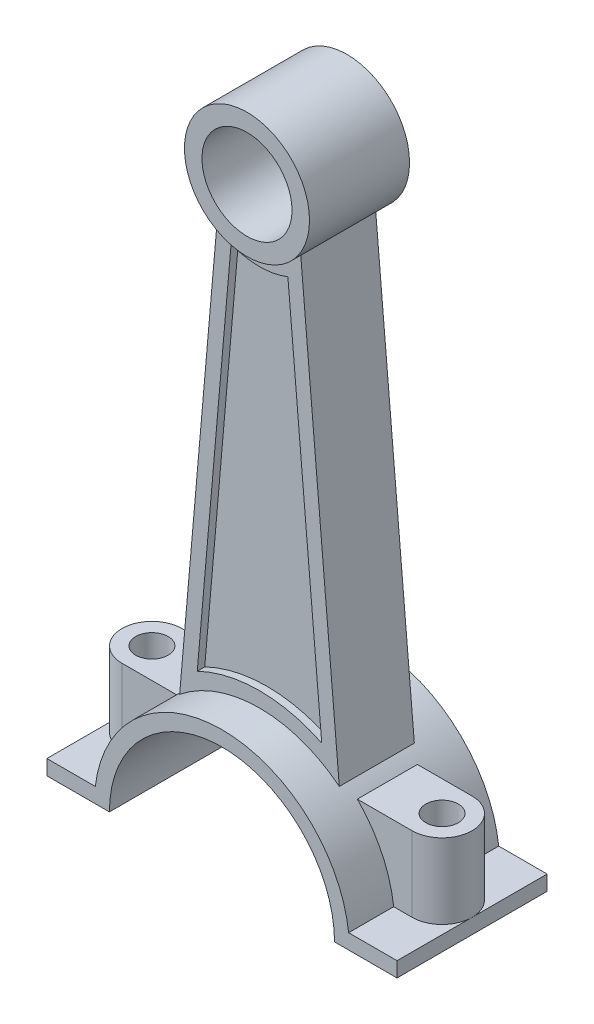
ISO-10303-21;
HEADER;
FILE_DESCRIPTION(('STEP AP214'),'2;1');
FILE_NAME('part.step','',(''),(''),'','','');
FILE_SCHEMA(('AUTOMOTIVE_DESIGN { 1 0 10303 214 1 1 1 1 }'));
ENDSEC;
DATA;
#1=APPLICATION_CONTEXT('core data for automotive mechanical design processes');
#2=APPLICATION_PROTOCOL_DEFINITION('international standard','automotive_design',2000,#1);
#3=PRODUCT_CONTEXT('',#1,'mechanical');
#4=PRODUCT('Part','Part','',(#3));
#5=PRODUCT_RELATED_PRODUCT_CATEGORY('part','',(#4));
#6=PRODUCT_DEFINITION_FORMATION('','',#4);
#7=PRODUCT_DEFINITION_CONTEXT('part definition',#1,'design');
#8=PRODUCT_DEFINITION('design','',#6,#7);
#9=PRODUCT_DEFINITION_SHAPE('','',#8);
#10=(LENGTH_UNIT() NAMED_UNIT(*) SI_UNIT(.MILLI.,.METRE.));
#11=(NAMED_UNIT(*) PLANE_ANGLE_UNIT() SI_UNIT($,.RADIAN.));
#12=(NAMED_UNIT(*) SI_UNIT($,.STERADIAN.) SOLID_ANGLE_UNIT());
#13=UNCERTAINTY_MEASURE_WITH_UNIT(LENGTH_MEASURE(1.E-05),#10,'distance_accuracy_value','');
#14=(GEOMETRIC_REPRESENTATION_CONTEXT(3) GLOBAL_UNCERTAINTY_ASSIGNED_CONTEXT((#13)) GLOBAL_UNIT_ASSIGNED_CONTEXT((#10,
#11,#12)) REPRESENTATION_CONTEXT('',''));
#15=CARTESIAN_POINT('',(0.,0.,0.));
#16=DIRECTION('',(0.,0.,1.));
#17=DIRECTION('',(1.,0.,0.));
#18=AXIS2_PLACEMENT_3D('',#15,#16,#17);
#19=CARTESIAN_POINT('',(35.,0.,15.));
#20=DIRECTION('',(-1.,0.,0.));
#21=DIRECTION('',(0.,0.,1.));
#22=AXIS2_PLACEMENT_3D('',#19,#20,#21);
#23=PLANE('',#22);
#24=DIRECTION('',(0.,0.,-1.));
#25=VECTOR('',#24,1.);
#26=CARTESIAN_POINT('',(35.,-114.4,15.));
#27=LINE('',#26,#25);
#28=CARTESIAN_POINT('',(35.,-114.4,0.));
#29=VERTEX_POINT('',#28);
#30=CARTESIAN_POINT('',(35.,-114.4,-15.));
#31=VERTEX_POINT('',#30);
#32=EDGE_CURVE('E469',#29,#31,#27,.T.);
#33=ORIENTED_EDGE('',*,*,#32,.F.);
#34=CARTESIAN_POINT('',(35.,-114.4,15.));
#35=VERTEX_POINT('',#34);
#36=EDGE_CURVE('E470',#35,#29,#27,.T.);
#37=ORIENTED_EDGE('',*,*,#36,.F.);
#38=DIRECTION('',(0.,1.,0.));
#39=VECTOR('',#38,1.);
#40=CARTESIAN_POINT('',(35.,0.,15.));
#41=LINE('',#40,#39);
#42=CARTESIAN_POINT('',(35.,-117.4,15.));
#43=VERTEX_POINT('',#42);
#44=EDGE_CURVE('E417',#43,#35,#41,.T.);
#45=ORIENTED_EDGE('',*,*,#44,.F.);
#46=DIRECTION('',(0.,0.,-1.));
#47=VECTOR('',#46,1.);
#48=CARTESIAN_POINT('',(35.,-117.4,15.));
#49=LINE('',#48,#47);
#50=CARTESIAN_POINT('',(35.,-117.4,-15.));
#51=VERTEX_POINT('',#50);
#52=EDGE_CURVE('E44',#43,#51,#49,.T.);
#53=ORIENTED_EDGE('',*,*,#52,.T.);
#54=DIRECTION('',(0.,1.,0.));
#55=VECTOR('',#54,1.);
#56=CARTESIAN_POINT('',(35.,0.,-15.));
#57=LINE('',#56,#55);
#58=EDGE_CURVE('E437',#51,#31,#57,.T.);
#59=ORIENTED_EDGE('',*,*,#58,.T.);
#60=EDGE_LOOP('',(#33,#37,#45,#53,#59));
#61=FACE_BOUND('',#60,.T.);
#62=ADVANCED_FACE('F36',(#61),#23,.F.);
#63=CARTESIAN_POINT('',(0.,-99.4,6.));
#64=DIRECTION('',(0.,1.,0.));
#65=DIRECTION('',(0.,0.,1.));
#66=AXIS2_PLACEMENT_3D('',#63,#64,#65);
#67=PLANE('',#66);
#68=CARTESIAN_POINT('',(-29.,-99.4,0.));
#69=DIRECTION('',(0.,1.,0.));
#70=DIRECTION('',(0.,0.,1.));
#71=AXIS2_PLACEMENT_3D('',#68,#69,#70);
#72=CIRCLE('',#71,3.25);
#73=CARTESIAN_POINT('',(-29.,-99.4,3.25));
#74=VERTEX_POINT('',#73);
#75=EDGE_CURVE('E299',#74,#74,#72,.T.);
#76=ORIENTED_EDGE('',*,*,#75,.F.);
#77=EDGE_LOOP('',(#76));
#78=FACE_BOUND('',#77,.T.);
#79=DIRECTION('',(1.,0.,0.));
#80=VECTOR('',#79,1.);
#81=CARTESIAN_POINT('',(0.,-99.4,-6.));
#82=LINE('',#81,#80);
#83=CARTESIAN_POINT('',(-29.,-99.4,-6.00000000000001));
#84=VERTEX_POINT('',#83);
#85=CARTESIAN_POINT('',(-18.0623918681884,-99.4,-6.));
#86=VERTEX_POINT('',#85);
#87=EDGE_CURVE('E405',#84,#86,#82,.T.);
#88=ORIENTED_EDGE('',*,*,#87,.F.);
#89=CARTESIAN_POINT('',(-29.,-99.4,0.));
#90=DIRECTION('',(0.,1.,0.));
#91=DIRECTION('',(0.,0.,1.));
#92=AXIS2_PLACEMENT_3D('',#89,#90,#91);
#93=CIRCLE('',#92,6.00000000000001);
#94=CARTESIAN_POINT('',(-29.,-99.4,6.00000000000001));
#95=VERTEX_POINT('',#94);
#96=EDGE_CURVE('E322',#95,#84,#93,.F.);
#97=ORIENTED_EDGE('',*,*,#96,.F.);
#98=DIRECTION('',(1.,0.,0.));
#99=VECTOR('',#98,1.);
#100=CARTESIAN_POINT('',(0.,-99.4,6.));
#101=LINE('',#100,#99);
#102=CARTESIAN_POINT('',(-18.0623918681884,-99.4,6.));
#103=VERTEX_POINT('',#102);
#104=EDGE_CURVE('E397',#95,#103,#101,.T.);
#105=ORIENTED_EDGE('',*,*,#104,.T.);
#106=DIRECTION('',(0.,0.,-1.));
#107=VECTOR('',#106,1.);
#108=CARTESIAN_POINT('',(-18.0623918681884,-99.4,6.));
#109=LINE('',#108,#107);
#110=EDGE_CURVE('E402',#103,#86,#109,.T.);
#111=ORIENTED_EDGE('',*,*,#110,.T.);
#112=EDGE_LOOP('',(#88,#97,#105,#111));
#113=FACE_BOUND('',#112,.T.);
#114=ADVANCED_FACE('F537',(#78,#113),#67,.T.);
#115=CARTESIAN_POINT('',(0.,-99.4,6.));
#116=DIRECTION('',(0.,-1.,0.));
#117=DIRECTION('',(0.,0.,-1.));
#118=AXIS2_PLACEMENT_3D('',#115,#116,#117);
#119=PLANE('',#118);
#120=CARTESIAN_POINT('',(29.,-99.4,0.));
#121=DIRECTION('',(0.,1.,0.));
#122=DIRECTION('',(0.,0.,1.));
#123=AXIS2_PLACEMENT_3D('',#120,#121,#122);
#124=CIRCLE('',#123,3.25);
#125=CARTESIAN_POINT('',(29.,-99.4,3.25));
#126=VERTEX_POINT('',#125);
#127=EDGE_CURVE('E289',#126,#126,#124,.T.);
#128=ORIENTED_EDGE('',*,*,#127,.F.);
#129=EDGE_LOOP('',(#128));
#130=FACE_BOUND('',#129,.T.);
#131=CARTESIAN_POINT('',(29.,-99.4,0.));
#132=DIRECTION('',(0.,1.,0.));
#133=DIRECTION('',(0.,0.,1.));
#134=AXIS2_PLACEMENT_3D('',#131,#132,#133);
#135=CIRCLE('',#134,6.00000000000001);
#136=CARTESIAN_POINT('',(29.,-99.4,6.));
#137=VERTEX_POINT('',#136);
#138=CARTESIAN_POINT('',(29.,-99.4,-6.));
#139=VERTEX_POINT('',#138);
#140=EDGE_CURVE('E314',#137,#139,#135,.T.);
#141=ORIENTED_EDGE('',*,*,#140,.T.);
#142=DIRECTION('',(-1.,0.,0.));
#143=VECTOR('',#142,1.);
#144=CARTESIAN_POINT('',(0.,-99.4,-6.));
#145=LINE('',#144,#143);
#146=CARTESIAN_POINT('',(18.0623918681885,-99.4,-6.));
#147=VERTEX_POINT('',#146);
#148=EDGE_CURVE('E381',#139,#147,#145,.T.);
#149=ORIENTED_EDGE('',*,*,#148,.T.);
#150=DIRECTION('',(0.,0.,-1.));
#151=VECTOR('',#150,1.);
#152=CARTESIAN_POINT('',(18.0623918681885,-99.4,6.));
#153=LINE('',#152,#151);
#154=CARTESIAN_POINT('',(18.0623918681885,-99.4,6.));
#155=VERTEX_POINT('',#154);
#156=EDGE_CURVE('E385',#155,#147,#153,.T.);
#157=ORIENTED_EDGE('',*,*,#156,.F.);
#158=DIRECTION('',(-1.,0.,0.));
#159=VECTOR('',#158,1.);
#160=CARTESIAN_POINT('',(0.,-99.4,6.));
#161=LINE('',#160,#159);
#162=EDGE_CURVE('E383',#137,#155,#161,.T.);
#163=ORIENTED_EDGE('',*,*,#162,.F.);
#164=EDGE_LOOP('',(#141,#149,#157,#163));
#165=FACE_BOUND('',#164,.T.);
#166=ADVANCED_FACE('F535',(#130,#165),#119,.F.);
#167=CARTESIAN_POINT('',(-35.,0.,15.));
#168=DIRECTION('',(-1.,0.,0.));
#169=DIRECTION('',(0.,0.,1.));
#170=AXIS2_PLACEMENT_3D('',#167,#168,#169);
#171=PLANE('',#170);
#172=DIRECTION('',(0.,0.,-1.));
#173=VECTOR('',#172,1.);
#174=CARTESIAN_POINT('',(-35.,-114.4,15.));
#175=LINE('',#174,#173);
#176=CARTESIAN_POINT('',(-35.,-114.4,15.));
#177=VERTEX_POINT('',#176);
#178=CARTESIAN_POINT('',(-35.,-114.4,0.));
#179=VERTEX_POINT('',#178);
#180=EDGE_CURVE('E458',#177,#179,#175,.T.);
#181=ORIENTED_EDGE('',*,*,#180,.T.);
#182=CARTESIAN_POINT('',(-35.,-114.4,-15.));
#183=VERTEX_POINT('',#182);
#184=EDGE_CURVE('E457',#179,#183,#175,.T.);
#185=ORIENTED_EDGE('',*,*,#184,.T.);
#186=DIRECTION('',(0.,1.,0.));
#187=VECTOR('',#186,1.);
#188=CARTESIAN_POINT('',(-35.,0.,-15.));
#189=LINE('',#188,#187);
#190=CARTESIAN_POINT('',(-35.,-117.4,-15.));
#191=VERTEX_POINT('',#190);
#192=EDGE_CURVE('E449',#191,#183,#189,.T.);
#193=ORIENTED_EDGE('',*,*,#192,.F.);
#194=DIRECTION('',(0.,0.,-1.));
#195=VECTOR('',#194,1.);
#196=CARTESIAN_POINT('',(-35.,-117.4,15.));
#197=LINE('',#196,#195);
#198=CARTESIAN_POINT('',(-35.,-117.4,15.));
#199=VERTEX_POINT('',#198);
#200=EDGE_CURVE('E455',#199,#191,#197,.T.);
#201=ORIENTED_EDGE('',*,*,#200,.F.);
#202=DIRECTION('',(0.,1.,0.));
#203=VECTOR('',#202,1.);
#204=CARTESIAN_POINT('',(-35.,0.,15.));
#205=LINE('',#204,#203);
#206=EDGE_CURVE('E426',#199,#177,#205,.T.);
#207=ORIENTED_EDGE('',*,*,#206,.T.);
#208=EDGE_LOOP('',(#181,#185,#193,#201,#207));
#209=FACE_BOUND('',#208,.T.);
#210=ADVANCED_FACE('F510',(#209),#171,.T.);
#211=CARTESIAN_POINT('',(0.,0.,-6.));
#212=DIRECTION('',(0.,0.,1.));
#213=DIRECTION('',(1.,0.,0.));
#214=AXIS2_PLACEMENT_3D('',#211,#212,#213);
#215=PLANE('',#214);
#216=DIRECTION('',(0.,1.,0.));
#217=VECTOR('',#216,1.);
#218=CARTESIAN_POINT('',(-29.,-114.4,-6.00000000000001));
#219=LINE('',#218,#217);
#220=CARTESIAN_POINT('',(-29.,-114.4,-6.00000000000001));
#221=VERTEX_POINT('',#220);
#222=EDGE_CURVE('E310',#221,#84,#219,.T.);
#223=ORIENTED_EDGE('',*,*,#222,.T.);
#224=ORIENTED_EDGE('',*,*,#87,.T.);
#225=CARTESIAN_POINT('',(0.,-117.4,-6.));
#226=DIRECTION('',(0.,0.,1.));
#227=DIRECTION('',(1.,0.,0.));
#228=AXIS2_PLACEMENT_3D('',#225,#226,#227);
#229=CIRCLE('',#228,25.5);
#230=CARTESIAN_POINT('',(-25.3229145242012,-114.4,-6.));
#231=VERTEX_POINT('',#230);
#232=EDGE_CURVE('E393',#86,#231,#229,.T.);
#233=ORIENTED_EDGE('',*,*,#232,.T.);
#234=DIRECTION('',(1.,0.,0.));
#235=VECTOR('',#234,1.);
#236=CARTESIAN_POINT('',(0.,-114.4,-6.));
#237=LINE('',#236,#235);
#238=EDGE_CURVE('E398',#221,#231,#237,.T.);
#239=ORIENTED_EDGE('',*,*,#238,.F.);
#240=EDGE_LOOP('',(#223,#224,#233,#239));
#241=FACE_BOUND('',#240,.T.);
#242=ADVANCED_FACE('F544',(#241),#215,.F.);
#243=CARTESIAN_POINT('',(0.,0.,-6.));
#244=DIRECTION('',(0.,0.,1.));
#245=DIRECTION('',(1.,0.,0.));
#246=AXIS2_PLACEMENT_3D('',#243,#244,#245);
#247=PLANE('',#246);
#248=DIRECTION('',(0.,1.,0.));
#249=VECTOR('',#248,1.);
#250=CARTESIAN_POINT('',(29.,-114.4,-6.));
#251=LINE('',#250,#249);
#252=CARTESIAN_POINT('',(29.,-114.4,-6.));
#253=VERTEX_POINT('',#252);
#254=EDGE_CURVE('E311',#253,#139,#251,.T.);
#255=ORIENTED_EDGE('',*,*,#254,.F.);
#256=DIRECTION('',(-1.,0.,0.));
#257=VECTOR('',#256,1.);
#258=CARTESIAN_POINT('',(0.,-114.4,-6.));
#259=LINE('',#258,#257);
#260=CARTESIAN_POINT('',(25.3229145242012,-114.4,-6.));
#261=VERTEX_POINT('',#260);
#262=EDGE_CURVE('E388',#253,#261,#259,.T.);
#263=ORIENTED_EDGE('',*,*,#262,.T.);
#264=CARTESIAN_POINT('',(0.,-117.4,-6.));
#265=DIRECTION('',(0.,0.,1.));
#266=DIRECTION('',(1.,0.,0.));
#267=AXIS2_PLACEMENT_3D('',#264,#265,#266);
#268=CIRCLE('',#267,25.5);
#269=EDGE_CURVE('E376',#261,#147,#268,.T.);
#270=ORIENTED_EDGE('',*,*,#269,.T.);
#271=ORIENTED_EDGE('',*,*,#148,.F.);
#272=EDGE_LOOP('',(#255,#263,#270,#271));
#273=FACE_BOUND('',#272,.T.);
#274=ADVANCED_FACE('F525',(#273),#247,.F.);
#275=CARTESIAN_POINT('',(0.,0.,6.));
#276=DIRECTION('',(0.,0.,1.));
#277=DIRECTION('',(1.,0.,0.));
#278=AXIS2_PLACEMENT_3D('',#275,#276,#277);
#279=PLANE('',#278);
#280=ORIENTED_EDGE('',*,*,#104,.F.);
#281=DIRECTION('',(0.,1.,0.));
#282=VECTOR('',#281,1.);
#283=CARTESIAN_POINT('',(-29.,-114.4,6.00000000000001));
#284=LINE('',#283,#282);
#285=CARTESIAN_POINT('',(-29.,-114.4,6.00000000000001));
#286=VERTEX_POINT('',#285);
#287=EDGE_CURVE('E321',#286,#95,#284,.T.);
#288=ORIENTED_EDGE('',*,*,#287,.F.);
#289=DIRECTION('',(1.,0.,0.));
#290=VECTOR('',#289,1.);
#291=CARTESIAN_POINT('',(0.,-114.4,6.));
#292=LINE('',#291,#290);
#293=CARTESIAN_POINT('',(-25.3229145242012,-114.4,6.));
#294=VERTEX_POINT('',#293);
#295=EDGE_CURVE('E400',#286,#294,#292,.T.);
#296=ORIENTED_EDGE('',*,*,#295,.T.);
#297=CARTESIAN_POINT('',(0.,-117.4,6.));
#298=DIRECTION('',(0.,0.,1.));
#299=DIRECTION('',(1.,0.,0.));
#300=AXIS2_PLACEMENT_3D('',#297,#298,#299);
#301=CIRCLE('',#300,25.5);
#302=EDGE_CURVE('E394',#103,#294,#301,.T.);
#303=ORIENTED_EDGE('',*,*,#302,.F.);
#304=EDGE_LOOP('',(#280,#288,#296,#303));
#305=FACE_BOUND('',#304,.T.);
#306=ADVANCED_FACE('F619',(#305),#279,.T.);
#307=CARTESIAN_POINT('',(0.,0.,6.));
#308=DIRECTION('',(0.,0.,1.));
#309=DIRECTION('',(1.,0.,0.));
#310=AXIS2_PLACEMENT_3D('',#307,#308,#309);
#311=PLANE('',#310);
#312=DIRECTION('',(-1.,0.,0.));
#313=VECTOR('',#312,1.);
#314=CARTESIAN_POINT('',(0.,-114.4,6.));
#315=LINE('',#314,#313);
#316=CARTESIAN_POINT('',(29.,-114.4,6.));
#317=VERTEX_POINT('',#316);
#318=CARTESIAN_POINT('',(25.3229145242012,-114.4,6.));
#319=VERTEX_POINT('',#318);
#320=EDGE_CURVE('E380',#317,#319,#315,.T.);
#321=ORIENTED_EDGE('',*,*,#320,.F.);
#322=DIRECTION('',(0.,1.,0.));
#323=VECTOR('',#322,1.);
#324=CARTESIAN_POINT('',(29.,-114.4,6.));
#325=LINE('',#324,#323);
#326=EDGE_CURVE('E324',#317,#137,#325,.T.);
#327=ORIENTED_EDGE('',*,*,#326,.T.);
#328=ORIENTED_EDGE('',*,*,#162,.T.);
#329=CARTESIAN_POINT('',(0.,-117.4,6.));
#330=DIRECTION('',(0.,0.,1.));
#331=DIRECTION('',(1.,0.,0.));
#332=AXIS2_PLACEMENT_3D('',#329,#330,#331);
#333=CIRCLE('',#332,25.5);
#334=EDGE_CURVE('E377',#319,#155,#333,.T.);
#335=ORIENTED_EDGE('',*,*,#334,.F.);
#336=EDGE_LOOP('',(#321,#327,#328,#335));
#337=FACE_BOUND('',#336,.T.);
#338=ADVANCED_FACE('F532',(#337),#311,.T.);
#339=CARTESIAN_POINT('',(0.,-114.4,15.));
#340=DIRECTION('',(0.,-1.,0.));
#341=DIRECTION('',(0.,0.,-1.));
#342=AXIS2_PLACEMENT_3D('',#339,#340,#341);
#343=PLANE('',#342);
#344=ORIENTED_EDGE('',*,*,#262,.F.);
#345=CARTESIAN_POINT('',(29.,-114.4,0.));
#346=DIRECTION('',(0.,1.,0.));
#347=DIRECTION('',(0.,0.,1.));
#348=AXIS2_PLACEMENT_3D('',#345,#346,#347);
#349=CIRCLE('',#348,6.00000000000001);
#350=EDGE_CURVE('E298',#29,#253,#349,.T.);
#351=ORIENTED_EDGE('',*,*,#350,.F.);
#352=ORIENTED_EDGE('',*,*,#32,.T.);
#353=DIRECTION('',(-1.,0.,0.));
#354=VECTOR('',#353,1.);
#355=CARTESIAN_POINT('',(0.,-114.4,-15.));
#356=LINE('',#355,#354);
#357=CARTESIAN_POINT('',(25.3229145242012,-114.4,-15.));
#358=VERTEX_POINT('',#357);
#359=EDGE_CURVE('E440',#31,#358,#356,.T.);
#360=ORIENTED_EDGE('',*,*,#359,.T.);
#361=DIRECTION('',(0.,0.,-1.));
#362=VECTOR('',#361,1.);
#363=CARTESIAN_POINT('',(25.3229145242012,-114.4,15.));
#364=LINE('',#363,#362);
#365=EDGE_CURVE('E465',#261,#358,#364,.T.);
#366=ORIENTED_EDGE('',*,*,#365,.F.);
#367=EDGE_LOOP('',(#344,#351,#352,#360,#366));
#368=FACE_BOUND('',#367,.T.);
#369=ADVANCED_FACE('F489',(#368),#343,.F.);
#370=CARTESIAN_POINT('',(0.,-114.4,15.));
#371=DIRECTION('',(0.,1.,0.));
#372=DIRECTION('',(0.,0.,1.));
#373=AXIS2_PLACEMENT_3D('',#370,#371,#372);
#374=PLANE('',#373);
#375=ORIENTED_EDGE('',*,*,#184,.F.);
#376=CARTESIAN_POINT('',(-29.,-114.4,0.));
#377=DIRECTION('',(0.,1.,0.));
#378=DIRECTION('',(0.,0.,1.));
#379=AXIS2_PLACEMENT_3D('',#376,#377,#378);
#380=CIRCLE('',#379,6.00000000000001);
#381=EDGE_CURVE('E307',#179,#221,#380,.F.);
#382=ORIENTED_EDGE('',*,*,#381,.T.);
#383=ORIENTED_EDGE('',*,*,#238,.T.);
#384=DIRECTION('',(0.,0.,-1.));
#385=VECTOR('',#384,1.);
#386=CARTESIAN_POINT('',(-25.3229145242012,-114.4,15.));
#387=LINE('',#386,#385);
#388=CARTESIAN_POINT('',(-25.3229145242012,-114.4,-15.));
#389=VERTEX_POINT('',#388);
#390=EDGE_CURVE('E461',#231,#389,#387,.T.);
#391=ORIENTED_EDGE('',*,*,#390,.T.);
#392=DIRECTION('',(1.,0.,0.));
#393=VECTOR('',#392,1.);
#394=CARTESIAN_POINT('',(0.,-114.4,-15.));
#395=LINE('',#394,#393);
#396=EDGE_CURVE('E446',#183,#389,#395,.T.);
#397=ORIENTED_EDGE('',*,*,#396,.F.);
#398=EDGE_LOOP('',(#375,#382,#383,#391,#397));
#399=FACE_BOUND('',#398,.T.);
#400=ADVANCED_FACE('F513',(#399),#374,.T.);
#401=CARTESIAN_POINT('',(0.,-117.4,15.));
#402=DIRECTION('',(0.,0.,-1.));
#403=DIRECTION('',(-1.,0.,0.));
#404=AXIS2_PLACEMENT_3D('',#401,#402,#403);
#405=CYLINDRICAL_SURFACE('',#404,22.5);
#406=CARTESIAN_POINT('',(0.,-117.4,-15.));
#407=DIRECTION('',(0.,0.,1.));
#408=DIRECTION('',(1.,0.,0.));
#409=AXIS2_PLACEMENT_3D('',#406,#407,#408);
#410=CIRCLE('',#409,22.5);
#411=CARTESIAN_POINT('',(22.5,-117.4,-15.));
#412=VERTEX_POINT('',#411);
#413=CARTESIAN_POINT('',(-22.5,-117.4,-15.));
#414=VERTEX_POINT('',#413);
#415=EDGE_CURVE('E410',#412,#414,#410,.T.);
#416=ORIENTED_EDGE('',*,*,#415,.F.);
#417=DIRECTION('',(0.,0.,-1.));
#418=VECTOR('',#417,1.);
#419=CARTESIAN_POINT('',(22.5,-117.4,15.));
#420=LINE('',#419,#418);
#421=CARTESIAN_POINT('',(22.5,-117.4,15.));
#422=VERTEX_POINT('',#421);
#423=EDGE_CURVE('E11',#422,#412,#420,.T.);
#424=ORIENTED_EDGE('',*,*,#423,.F.);
#425=CARTESIAN_POINT('',(0.,-117.4,15.));
#426=DIRECTION('',(0.,0.,1.));
#427=DIRECTION('',(1.,0.,0.));
#428=AXIS2_PLACEMENT_3D('',#425,#426,#427);
#429=CIRCLE('',#428,22.5);
#430=CARTESIAN_POINT('',(-22.5,-117.4,15.));
#431=VERTEX_POINT('',#430);
#432=EDGE_CURVE('E411',#422,#431,#429,.T.);
#433=ORIENTED_EDGE('',*,*,#432,.T.);
#434=DIRECTION('',(0.,0.,-1.));
#435=VECTOR('',#434,1.);
#436=CARTESIAN_POINT('',(-22.5,-117.4,15.));
#437=LINE('',#436,#435);
#438=EDGE_CURVE('E432',#431,#414,#437,.T.);
#439=ORIENTED_EDGE('',*,*,#438,.T.);
#440=EDGE_LOOP('',(#416,#424,#433,#439));
#441=FACE_BOUND('',#440,.T.);
#442=ADVANCED_FACE('F38',(#441),#405,.F.);
#443=CARTESIAN_POINT('',(0.,-117.4,15.));
#444=DIRECTION('',(0.,1.,0.));
#445=DIRECTION('',(0.,0.,1.));
#446=AXIS2_PLACEMENT_3D('',#443,#444,#445);
#447=PLANE('',#446);
#448=CARTESIAN_POINT('',(29.,-117.4,0.));
#449=DIRECTION('',(0.,1.,0.));
#450=DIRECTION('',(0.,0.,1.));
#451=AXIS2_PLACEMENT_3D('',#448,#449,#450);
#452=CIRCLE('',#451,3.25);
#453=CARTESIAN_POINT('',(29.,-117.4,3.25));
#454=VERTEX_POINT('',#453);
#455=EDGE_CURVE('E302',#454,#454,#452,.T.);
#456=ORIENTED_EDGE('',*,*,#455,.T.);
#457=EDGE_LOOP('',(#456));
#458=FACE_BOUND('',#457,.T.);
#459=DIRECTION('',(1.,0.,0.));
#460=VECTOR('',#459,1.);
#461=CARTESIAN_POINT('',(0.,-117.4,-15.));
#462=LINE('',#461,#460);
#463=EDGE_CURVE('E435',#412,#51,#462,.T.);
#464=ORIENTED_EDGE('',*,*,#463,.T.);
#465=ORIENTED_EDGE('',*,*,#52,.F.);
#466=DIRECTION('',(1.,0.,0.));
#467=VECTOR('',#466,1.);
#468=CARTESIAN_POINT('',(0.,-117.4,15.));
#469=LINE('',#468,#467);
#470=EDGE_CURVE('E414',#422,#43,#469,.T.);
#471=ORIENTED_EDGE('',*,*,#470,.F.);
#472=ORIENTED_EDGE('',*,*,#423,.T.);
#473=EDGE_LOOP('',(#464,#465,#471,#472));
#474=FACE_BOUND('',#473,.T.);
#475=ADVANCED_FACE('F502',(#458,#474),#447,.F.);
#476=ORIENTED_EDGE('',*,*,#36,.T.);
#477=CARTESIAN_POINT('',(29.,-114.4,0.));
#478=DIRECTION('',(0.,1.,0.));
#479=DIRECTION('',(0.,0.,1.));
#480=AXIS2_PLACEMENT_3D('',#477,#478,#479);
#481=CIRCLE('',#480,6.00000000000001);
#482=EDGE_CURVE('E327',#317,#29,#481,.T.);
#483=ORIENTED_EDGE('',*,*,#482,.F.);
#484=ORIENTED_EDGE('',*,*,#320,.T.);
#485=CARTESIAN_POINT('',(25.3229145242012,-114.4,15.));
#486=VERTEX_POINT('',#485);
#487=EDGE_CURVE('E466',#486,#319,#364,.T.);
#488=ORIENTED_EDGE('',*,*,#487,.F.);
#489=DIRECTION('',(-1.,0.,0.));
#490=VECTOR('',#489,1.);
#491=CARTESIAN_POINT('',(0.,-114.4,15.));
#492=LINE('',#491,#490);
#493=EDGE_CURVE('E419',#35,#486,#492,.T.);
#494=ORIENTED_EDGE('',*,*,#493,.F.);
#495=EDGE_LOOP('',(#476,#483,#484,#488,#494));
#496=FACE_BOUND('',#495,.T.);
#497=ADVANCED_FACE('F494',(#496),#343,.F.);
#498=CARTESIAN_POINT('',(0.,-117.4,15.));
#499=DIRECTION('',(0.,0.,-1.));
#500=DIRECTION('',(-1.,0.,0.));
#501=AXIS2_PLACEMENT_3D('',#498,#499,#500);
#502=CYLINDRICAL_SURFACE('',#501,25.5);
#503=DIRECTION('',(0.,0.,-1.));
#504=VECTOR('',#503,1.);
#505=CARTESIAN_POINT('',(15.9573776041053,-97.51,7.5));
#506=LINE('',#505,#504);
#507=CARTESIAN_POINT('',(15.9573776041053,-97.51,7.5));
#508=VERTEX_POINT('',#507);
#509=CARTESIAN_POINT('',(15.9573776041053,-97.51,-7.5));
#510=VERTEX_POINT('',#509);
#511=EDGE_CURVE('E373',#508,#510,#506,.T.);
#512=ORIENTED_EDGE('',*,*,#511,.F.);
#513=CARTESIAN_POINT('',(0.,-117.4,7.5));
#514=DIRECTION('',(0.,0.,1.));
#515=DIRECTION('',(1.,0.,0.));
#516=AXIS2_PLACEMENT_3D('',#513,#514,#515);
#517=CIRCLE('',#516,25.5);
#518=CARTESIAN_POINT('',(-15.9573776041053,-97.51,7.5));
#519=VERTEX_POINT('',#518);
#520=EDGE_CURVE('E345',#508,#519,#517,.T.);
#521=ORIENTED_EDGE('',*,*,#520,.T.);
#522=DIRECTION('',(0.,0.,-1.));
#523=VECTOR('',#522,1.);
#524=CARTESIAN_POINT('',(-15.9573776041053,-97.51,7.5));
#525=LINE('',#524,#523);
#526=CARTESIAN_POINT('',(-15.9573776041053,-97.51,-7.5));
#527=VERTEX_POINT('',#526);
#528=EDGE_CURVE('E356',#519,#527,#525,.T.);
#529=ORIENTED_EDGE('',*,*,#528,.T.);
#530=CARTESIAN_POINT('',(0.,-117.4,-7.5));
#531=DIRECTION('',(0.,0.,1.));
#532=DIRECTION('',(1.,0.,0.));
#533=AXIS2_PLACEMENT_3D('',#530,#531,#532);
#534=CIRCLE('',#533,25.5);
#535=EDGE_CURVE('E340',#510,#527,#534,.T.);
#536=ORIENTED_EDGE('',*,*,#535,.F.);
#537=EDGE_LOOP('',(#512,#521,#529,#536));
#538=FACE_BOUND('',#537,.T.);
#539=ORIENTED_EDGE('',*,*,#487,.T.);
#540=ORIENTED_EDGE('',*,*,#334,.T.);
#541=ORIENTED_EDGE('',*,*,#156,.T.);
#542=ORIENTED_EDGE('',*,*,#269,.F.);
#543=ORIENTED_EDGE('',*,*,#365,.T.);
#544=CARTESIAN_POINT('',(0.,-117.4,-15.));
#545=DIRECTION('',(0.,0.,1.));
#546=DIRECTION('',(1.,0.,0.));
#547=AXIS2_PLACEMENT_3D('',#544,#545,#546);
#548=CIRCLE('',#547,25.5);
#549=EDGE_CURVE('E443',#358,#389,#548,.T.);
#550=ORIENTED_EDGE('',*,*,#549,.T.);
#551=ORIENTED_EDGE('',*,*,#390,.F.);
#552=ORIENTED_EDGE('',*,*,#232,.F.);
#553=ORIENTED_EDGE('',*,*,#110,.F.);
#554=ORIENTED_EDGE('',*,*,#302,.T.);
#555=CARTESIAN_POINT('',(-25.3229145242012,-114.4,15.));
#556=VERTEX_POINT('',#555);
#557=EDGE_CURVE('E462',#556,#294,#387,.T.);
#558=ORIENTED_EDGE('',*,*,#557,.F.);
#559=CARTESIAN_POINT('',(0.,-117.4,15.));
#560=DIRECTION('',(0.,0.,1.));
#561=DIRECTION('',(1.,0.,0.));
#562=AXIS2_PLACEMENT_3D('',#559,#560,#561);
#563=CIRCLE('',#562,25.5);
#564=EDGE_CURVE('E421',#486,#556,#563,.T.);
#565=ORIENTED_EDGE('',*,*,#564,.F.);
#566=EDGE_LOOP('',(#539,#540,#541,#542,#543,#550,#551,#552,#553,#554,#558,#565));
#567=FACE_BOUND('',#566,.T.);
#568=ADVANCED_FACE('F519',(#538,#567),#502,.T.);
#569=ORIENTED_EDGE('',*,*,#295,.F.);
#570=CARTESIAN_POINT('',(-29.,-114.4,0.));
#571=DIRECTION('',(0.,1.,0.));
#572=DIRECTION('',(0.,0.,1.));
#573=AXIS2_PLACEMENT_3D('',#570,#571,#572);
#574=CIRCLE('',#573,6.00000000000001);
#575=EDGE_CURVE('E318',#286,#179,#574,.F.);
#576=ORIENTED_EDGE('',*,*,#575,.T.);
#577=ORIENTED_EDGE('',*,*,#180,.F.);
#578=DIRECTION('',(1.,0.,0.));
#579=VECTOR('',#578,1.);
#580=CARTESIAN_POINT('',(0.,-114.4,15.));
#581=LINE('',#580,#579);
#582=EDGE_CURVE('E423',#177,#556,#581,.T.);
#583=ORIENTED_EDGE('',*,*,#582,.T.);
#584=ORIENTED_EDGE('',*,*,#557,.T.);
#585=EDGE_LOOP('',(#569,#576,#577,#583,#584));
#586=FACE_BOUND('',#585,.T.);
#587=ADVANCED_FACE('F636',(#586),#374,.T.);
#588=CARTESIAN_POINT('',(0.,-117.4,15.));
#589=DIRECTION('',(0.,-1.,0.));
#590=DIRECTION('',(0.,0.,-1.));
#591=AXIS2_PLACEMENT_3D('',#588,#589,#590);
#592=PLANE('',#591);
#593=CARTESIAN_POINT('',(-29.,-117.4,0.));
#594=DIRECTION('',(0.,1.,0.));
#595=DIRECTION('',(0.,0.,1.));
#596=AXIS2_PLACEMENT_3D('',#593,#594,#595);
#597=CIRCLE('',#596,3.25);
#598=CARTESIAN_POINT('',(-29.,-117.4,3.25));
#599=VERTEX_POINT('',#598);
#600=EDGE_CURVE('E295',#599,#599,#597,.T.);
#601=ORIENTED_EDGE('',*,*,#600,.T.);
#602=EDGE_LOOP('',(#601));
#603=FACE_BOUND('',#602,.T.);
#604=DIRECTION('',(-1.,0.,0.));
#605=VECTOR('',#604,1.);
#606=CARTESIAN_POINT('',(0.,-117.4,-15.));
#607=LINE('',#606,#605);
#608=EDGE_CURVE('E415',#414,#191,#607,.T.);
#609=ORIENTED_EDGE('',*,*,#608,.F.);
#610=ORIENTED_EDGE('',*,*,#438,.F.);
#611=DIRECTION('',(-1.,0.,0.));
#612=VECTOR('',#611,1.);
#613=CARTESIAN_POINT('',(0.,-117.4,15.));
#614=LINE('',#613,#612);
#615=EDGE_CURVE('E429',#431,#199,#614,.T.);
#616=ORIENTED_EDGE('',*,*,#615,.T.);
#617=ORIENTED_EDGE('',*,*,#200,.T.);
#618=EDGE_LOOP('',(#609,#610,#616,#617));
#619=FACE_BOUND('',#618,.T.);
#620=ADVANCED_FACE('F506',(#603,#619),#592,.T.);
#621=CARTESIAN_POINT('',(0.,0.,15.));
#622=DIRECTION('',(0.,0.,1.));
#623=DIRECTION('',(1.,0.,0.));
#624=AXIS2_PLACEMENT_3D('',#621,#622,#623);
#625=PLANE('',#624);
#626=ORIENTED_EDGE('',*,*,#432,.F.);
#627=ORIENTED_EDGE('',*,*,#470,.T.);
#628=ORIENTED_EDGE('',*,*,#44,.T.);
#629=ORIENTED_EDGE('',*,*,#493,.T.);
#630=ORIENTED_EDGE('',*,*,#564,.T.);
#631=ORIENTED_EDGE('',*,*,#582,.F.);
#632=ORIENTED_EDGE('',*,*,#206,.F.);
#633=ORIENTED_EDGE('',*,*,#615,.F.);
#634=EDGE_LOOP('',(#626,#627,#628,#629,#630,#631,#632,#633));
#635=FACE_BOUND('',#634,.T.);
#636=ADVANCED_FACE('F498',(#635),#625,.T.);
#637=CARTESIAN_POINT('',(0.,0.,-15.));
#638=DIRECTION('',(0.,0.,1.));
#639=DIRECTION('',(1.,0.,0.));
#640=AXIS2_PLACEMENT_3D('',#637,#638,#639);
#641=PLANE('',#640);
#642=ORIENTED_EDGE('',*,*,#415,.T.);
#643=ORIENTED_EDGE('',*,*,#608,.T.);
#644=ORIENTED_EDGE('',*,*,#192,.T.);
#645=ORIENTED_EDGE('',*,*,#396,.T.);
#646=ORIENTED_EDGE('',*,*,#549,.F.);
#647=ORIENTED_EDGE('',*,*,#359,.F.);
#648=ORIENTED_EDGE('',*,*,#58,.F.);
#649=ORIENTED_EDGE('',*,*,#463,.F.);
#650=EDGE_LOOP('',(#642,#643,#644,#645,#646,#647,#648,#649));
#651=FACE_BOUND('',#650,.T.);
#652=ADVANCED_FACE('F483',(#651),#641,.F.);
#653=CARTESIAN_POINT('',(7.36994649103488,0.644786768758193,7.5));
#654=DIRECTION('',(-0.996194698091746,-0.0871557427476551,0.));
#655=DIRECTION('',(0.0871557427476551,-0.996194698091746,0.));
#656=AXIS2_PLACEMENT_3D('',#653,#654,#655);
#657=PLANE('',#656);
#658=DIRECTION('',(-0.0871557427476551,0.996194698091746,0.));
#659=VECTOR('',#658,1.);
#660=CARTESIAN_POINT('',(7.36994649103488,0.644786768758193,-7.5));
#661=LINE('',#660,#659);
#662=CARTESIAN_POINT('',(8.24809472382678,-9.39249346163099,-7.5));
#663=VERTEX_POINT('',#662);
#664=EDGE_CURVE('E359',#510,#663,#661,.T.);
#665=ORIENTED_EDGE('',*,*,#664,.T.);
#666=DIRECTION('',(0.,0.,-1.));
#667=VECTOR('',#666,1.);
#668=CARTESIAN_POINT('',(8.24809472382678,-9.39249346163099,7.5));
#669=LINE('',#668,#667);
#670=CARTESIAN_POINT('',(8.24809472382678,-9.39249346163099,7.5));
#671=VERTEX_POINT('',#670);
#672=EDGE_CURVE('E371',#671,#663,#669,.T.);
#673=ORIENTED_EDGE('',*,*,#672,.F.);
#674=DIRECTION('',(-0.0871557427476551,0.996194698091746,0.));
#675=VECTOR('',#674,1.);
#676=CARTESIAN_POINT('',(7.36994649103488,0.644786768758193,7.5));
#677=LINE('',#676,#675);
#678=EDGE_CURVE('E347',#508,#671,#677,.T.);
#679=ORIENTED_EDGE('',*,*,#678,.F.);
#680=ORIENTED_EDGE('',*,*,#511,.T.);
#681=EDGE_LOOP('',(#665,#673,#679,#680));
#682=FACE_BOUND('',#681,.T.);
#683=ADVANCED_FACE('F613',(#682),#657,.F.);
#684=CARTESIAN_POINT('',(-7.36994649103488,0.64478676875819,7.5));
#685=DIRECTION('',(-0.996194698091746,0.0871557427476549,0.));
#686=DIRECTION('',(-0.0871557427476549,-0.996194698091746,0.));
#687=AXIS2_PLACEMENT_3D('',#684,#685,#686);
#688=PLANE('',#687);
#689=DIRECTION('',(0.0871557427476549,0.996194698091746,0.));
#690=VECTOR('',#689,1.);
#691=CARTESIAN_POINT('',(-7.36994649103488,0.64478676875819,-7.5));
#692=LINE('',#691,#690);
#693=CARTESIAN_POINT('',(-8.24809472382678,-9.39249346163099,-7.5));
#694=VERTEX_POINT('',#693);
#695=EDGE_CURVE('E348',#527,#694,#692,.T.);
#696=ORIENTED_EDGE('',*,*,#695,.F.);
#697=ORIENTED_EDGE('',*,*,#528,.F.);
#698=DIRECTION('',(0.0871557427476549,0.996194698091746,0.));
#699=VECTOR('',#698,1.);
#700=CARTESIAN_POINT('',(-7.36994649103488,0.64478676875819,7.5));
#701=LINE('',#700,#699);
#702=CARTESIAN_POINT('',(-8.24809472382677,-9.39249346163099,7.5));
#703=VERTEX_POINT('',#702);
#704=EDGE_CURVE('E353',#519,#703,#701,.T.);
#705=ORIENTED_EDGE('',*,*,#704,.T.);
#706=DIRECTION('',(0.,0.,-1.));
#707=VECTOR('',#706,1.);
#708=CARTESIAN_POINT('',(-8.24809472382677,-9.39249346163099,7.5));
#709=LINE('',#708,#707);
#710=EDGE_CURVE('E368',#703,#694,#709,.T.);
#711=ORIENTED_EDGE('',*,*,#710,.T.);
#712=EDGE_LOOP('',(#696,#697,#705,#711));
#713=FACE_BOUND('',#712,.T.);
#714=ADVANCED_FACE('F606',(#713),#688,.T.);
#715=CARTESIAN_POINT('',(0.,0.,7.5));
#716=DIRECTION('',(0.,0.,1.));
#717=DIRECTION('',(1.,0.,0.));
#718=AXIS2_PLACEMENT_3D('',#715,#716,#717);
#719=PLANE('',#718);
#720=CARTESIAN_POINT('',(0.,0.,7.5));
#721=DIRECTION('',(0.,0.,-1.));
#722=DIRECTION('',(1.,0.,0.));
#723=AXIS2_PLACEMENT_3D('',#720,#721,#722);
#724=CIRCLE('',#723,15.5);
#725=CARTESIAN_POINT('',(5.6767522219735,-14.4230539141445,7.5));
#726=VERTEX_POINT('',#725);
#727=CARTESIAN_POINT('',(-5.67675222197349,-14.4230539141445,7.5));
#728=VERTEX_POINT('',#727);
#729=EDGE_CURVE('E59',#726,#728,#724,.T.);
#730=ORIENTED_EDGE('',*,*,#729,.F.);
#731=DIRECTION('',(-0.0871557427476551,0.996194698091746,0.));
#732=VECTOR('',#731,1.);
#733=CARTESIAN_POINT('',(5.6767522219735,-14.4230539141445,7.5));
#734=LINE('',#733,#732);
#735=CARTESIAN_POINT('',(12.4428303423228,-91.7596807143091,7.5));
#736=VERTEX_POINT('',#735);
#737=EDGE_CURVE('E268',#736,#726,#734,.T.);
#738=ORIENTED_EDGE('',*,*,#737,.F.);
#739=CARTESIAN_POINT('',(0.,-117.4,7.5));
#740=DIRECTION('',(0.,0.,-1.));
#741=DIRECTION('',(1.,0.,0.));
#742=AXIS2_PLACEMENT_3D('',#739,#740,#741);
#743=CIRCLE('',#742,28.5);
#744=CARTESIAN_POINT('',(-12.4428303423228,-91.7596807143091,7.5));
#745=VERTEX_POINT('',#744);
#746=EDGE_CURVE('E282',#745,#736,#743,.T.);
#747=ORIENTED_EDGE('',*,*,#746,.F.);
#748=DIRECTION('',(-0.0871557427476549,-0.996194698091746,0.));
#749=VECTOR('',#748,1.);
#750=CARTESIAN_POINT('',(-12.4428303423228,-91.7596807143091,7.5));
#751=LINE('',#750,#749);
#752=EDGE_CURVE('E279',#728,#745,#751,.T.);
#753=ORIENTED_EDGE('',*,*,#752,.F.);
#754=EDGE_LOOP('',(#730,#738,#747,#753));
#755=FACE_BOUND('',#754,.T.);
#756=ORIENTED_EDGE('',*,*,#520,.F.);
#757=ORIENTED_EDGE('',*,*,#678,.T.);
#758=CARTESIAN_POINT('',(0.,0.,7.5));
#759=DIRECTION('',(0.,0.,1.));
#760=DIRECTION('',(1.,0.,0.));
#761=AXIS2_PLACEMENT_3D('',#758,#759,#760);
#762=CIRCLE('',#761,12.5);
#763=EDGE_CURVE('E351',#703,#671,#762,.T.);
#764=ORIENTED_EDGE('',*,*,#763,.F.);
#765=ORIENTED_EDGE('',*,*,#704,.F.);
#766=EDGE_LOOP('',(#756,#757,#764,#765));
#767=FACE_BOUND('',#766,.T.);
#768=ADVANCED_FACE('F603',(#755,#767),#719,.T.);
#769=CARTESIAN_POINT('',(0.,0.,-7.5));
#770=DIRECTION('',(0.,0.,1.));
#771=DIRECTION('',(1.,0.,0.));
#772=AXIS2_PLACEMENT_3D('',#769,#770,#771);
#773=PLANE('',#772);
#774=DIRECTION('',(0.0871557427476548,-0.996194698091746,0.));
#775=VECTOR('',#774,1.);
#776=CARTESIAN_POINT('',(12.4428303423228,-91.7596807143091,-7.5));
#777=LINE('',#776,#775);
#778=CARTESIAN_POINT('',(5.67675222197351,-14.4230539141445,-7.5));
#779=VERTEX_POINT('',#778);
#780=CARTESIAN_POINT('',(12.4428303423228,-91.7596807143091,-7.5));
#781=VERTEX_POINT('',#780);
#782=EDGE_CURVE('E255',#779,#781,#777,.T.);
#783=ORIENTED_EDGE('',*,*,#782,.F.);
#784=CARTESIAN_POINT('',(0.,0.,-7.5));
#785=DIRECTION('',(0.,0.,1.));
#786=DIRECTION('',(-1.,0.,0.));
#787=AXIS2_PLACEMENT_3D('',#784,#785,#786);
#788=CIRCLE('',#787,15.5);
#789=CARTESIAN_POINT('',(-5.67675222197347,-14.4230539141445,-7.5));
#790=VERTEX_POINT('',#789);
#791=EDGE_CURVE('E51',#790,#779,#788,.T.);
#792=ORIENTED_EDGE('',*,*,#791,.F.);
#793=DIRECTION('',(0.0871557427476551,0.996194698091746,0.));
#794=VECTOR('',#793,1.);
#795=CARTESIAN_POINT('',(-5.67675222197347,-14.4230539141445,-7.5));
#796=LINE('',#795,#794);
#797=CARTESIAN_POINT('',(-12.4428303423228,-91.7596807143091,-7.5));
#798=VERTEX_POINT('',#797);
#799=EDGE_CURVE('E246',#798,#790,#796,.T.);
#800=ORIENTED_EDGE('',*,*,#799,.F.);
#801=CARTESIAN_POINT('',(0.,-117.4,-7.5));
#802=DIRECTION('',(0.,0.,1.));
#803=DIRECTION('',(-1.,0.,0.));
#804=AXIS2_PLACEMENT_3D('',#801,#802,#803);
#805=CIRCLE('',#804,28.5);
#806=EDGE_CURVE('E249',#781,#798,#805,.T.);
#807=ORIENTED_EDGE('',*,*,#806,.F.);
#808=EDGE_LOOP('',(#783,#792,#800,#807));
#809=FACE_BOUND('',#808,.T.);
#810=ORIENTED_EDGE('',*,*,#535,.T.);
#811=ORIENTED_EDGE('',*,*,#695,.T.);
#812=CARTESIAN_POINT('',(0.,0.,-7.5));
#813=DIRECTION('',(0.,0.,1.));
#814=DIRECTION('',(1.,0.,0.));
#815=AXIS2_PLACEMENT_3D('',#812,#813,#814);
#816=CIRCLE('',#815,12.5);
#817=EDGE_CURVE('E362',#694,#663,#816,.T.);
#818=ORIENTED_EDGE('',*,*,#817,.T.);
#819=ORIENTED_EDGE('',*,*,#664,.F.);
#820=EDGE_LOOP('',(#810,#811,#818,#819));
#821=FACE_BOUND('',#820,.T.);
#822=ADVANCED_FACE('F601',(#809,#821),#773,.F.);
#823=CARTESIAN_POINT('',(0.,0.,10.));
#824=DIRECTION('',(0.,0.,-1.));
#825=DIRECTION('',(-1.,0.,0.));
#826=AXIS2_PLACEMENT_3D('',#823,#824,#825);
#827=CYLINDRICAL_SURFACE('',#826,9.);
#828=CARTESIAN_POINT('',(0.,0.,10.));
#829=DIRECTION('',(0.,0.,1.));
#830=DIRECTION('',(1.,0.,0.));
#831=AXIS2_PLACEMENT_3D('',#828,#829,#830);
#832=CIRCLE('',#831,9.);
#833=CARTESIAN_POINT('',(9.,0.,10.));
#834=VERTEX_POINT('',#833);
#835=EDGE_CURVE('E333',#834,#834,#832,.T.);
#836=ORIENTED_EDGE('',*,*,#835,.T.);
#837=EDGE_LOOP('',(#836));
#838=FACE_BOUND('',#837,.T.);
#839=CARTESIAN_POINT('',(0.,0.,-10.));
#840=DIRECTION('',(0.,0.,1.));
#841=DIRECTION('',(1.,0.,0.));
#842=AXIS2_PLACEMENT_3D('',#839,#840,#841);
#843=CIRCLE('',#842,9.);
#844=CARTESIAN_POINT('',(9.,0.,-10.));
#845=VERTEX_POINT('',#844);
#846=EDGE_CURVE('E326',#845,#845,#843,.T.);
#847=ORIENTED_EDGE('',*,*,#846,.F.);
#848=EDGE_LOOP('',(#847));
#849=FACE_BOUND('',#848,.T.);
#850=ADVANCED_FACE('F597',(#838,#849),#827,.F.);
#851=CARTESIAN_POINT('',(0.,0.,10.));
#852=DIRECTION('',(0.,0.,-1.));
#853=DIRECTION('',(-1.,0.,0.));
#854=AXIS2_PLACEMENT_3D('',#851,#852,#853);
#855=CYLINDRICAL_SURFACE('',#854,12.5);
#856=ORIENTED_EDGE('',*,*,#763,.T.);
#857=ORIENTED_EDGE('',*,*,#672,.T.);
#858=ORIENTED_EDGE('',*,*,#817,.F.);
#859=ORIENTED_EDGE('',*,*,#710,.F.);
#860=EDGE_LOOP('',(#856,#857,#858,#859));
#861=FACE_BOUND('',#860,.T.);
#862=CARTESIAN_POINT('',(0.,0.,10.));
#863=DIRECTION('',(0.,0.,1.));
#864=DIRECTION('',(1.,0.,0.));
#865=AXIS2_PLACEMENT_3D('',#862,#863,#864);
#866=CIRCLE('',#865,12.5);
#867=CARTESIAN_POINT('',(12.5,0.,10.));
#868=VERTEX_POINT('',#867);
#869=EDGE_CURVE('E336',#868,#868,#866,.T.);
#870=ORIENTED_EDGE('',*,*,#869,.F.);
#871=EDGE_LOOP('',(#870));
#872=FACE_BOUND('',#871,.T.);
#873=CARTESIAN_POINT('',(0.,0.,-10.));
#874=DIRECTION('',(0.,0.,1.));
#875=DIRECTION('',(1.,0.,0.));
#876=AXIS2_PLACEMENT_3D('',#873,#874,#875);
#877=CIRCLE('',#876,12.5);
#878=CARTESIAN_POINT('',(12.5,0.,-10.));
#879=VERTEX_POINT('',#878);
#880=EDGE_CURVE('E337',#879,#879,#877,.T.);
#881=ORIENTED_EDGE('',*,*,#880,.T.);
#882=EDGE_LOOP('',(#881));
#883=FACE_BOUND('',#882,.T.);
#884=ADVANCED_FACE('F590',(#861,#872,#883),#855,.T.);
#885=CARTESIAN_POINT('',(0.,0.,10.));
#886=DIRECTION('',(0.,0.,1.));
#887=DIRECTION('',(1.,0.,0.));
#888=AXIS2_PLACEMENT_3D('',#885,#886,#887);
#889=PLANE('',#888);
#890=ORIENTED_EDGE('',*,*,#835,.F.);
#891=EDGE_LOOP('',(#890));
#892=FACE_BOUND('',#891,.T.);
#893=ORIENTED_EDGE('',*,*,#869,.T.);
#894=EDGE_LOOP('',(#893));
#895=FACE_BOUND('',#894,.T.);
#896=ADVANCED_FACE('F587',(#892,#895),#889,.T.);
#897=CARTESIAN_POINT('',(0.,0.,-10.));
#898=DIRECTION('',(0.,0.,1.));
#899=DIRECTION('',(1.,0.,0.));
#900=AXIS2_PLACEMENT_3D('',#897,#898,#899);
#901=PLANE('',#900);
#902=ORIENTED_EDGE('',*,*,#846,.T.);
#903=EDGE_LOOP('',(#902));
#904=FACE_BOUND('',#903,.T.);
#905=ORIENTED_EDGE('',*,*,#880,.F.);
#906=EDGE_LOOP('',(#905));
#907=FACE_BOUND('',#906,.T.);
#908=ADVANCED_FACE('F586',(#904,#907),#901,.F.);
#909=CARTESIAN_POINT('',(29.,-114.4,0.));
#910=DIRECTION('',(0.,1.,0.));
#911=DIRECTION('',(0.,0.,1.));
#912=AXIS2_PLACEMENT_3D('',#909,#910,#911);
#913=CYLINDRICAL_SURFACE('',#912,6.00000000000001);
#914=ORIENTED_EDGE('',*,*,#140,.F.);
#915=ORIENTED_EDGE('',*,*,#326,.F.);
#916=ORIENTED_EDGE('',*,*,#482,.T.);
#917=ORIENTED_EDGE('',*,*,#350,.T.);
#918=ORIENTED_EDGE('',*,*,#254,.T.);
#919=EDGE_LOOP('',(#914,#915,#916,#917,#918));
#920=FACE_BOUND('',#919,.T.);
#921=ADVANCED_FACE('F527',(#920),#913,.T.);
#922=CARTESIAN_POINT('',(-29.,-114.4,0.));
#923=DIRECTION('',(0.,1.,0.));
#924=DIRECTION('',(0.,0.,1.));
#925=AXIS2_PLACEMENT_3D('',#922,#923,#924);
#926=CYLINDRICAL_SURFACE('',#925,6.00000000000001);
#927=ORIENTED_EDGE('',*,*,#96,.T.);
#928=ORIENTED_EDGE('',*,*,#222,.F.);
#929=ORIENTED_EDGE('',*,*,#381,.F.);
#930=ORIENTED_EDGE('',*,*,#575,.F.);
#931=ORIENTED_EDGE('',*,*,#287,.T.);
#932=EDGE_LOOP('',(#927,#928,#929,#930,#931));
#933=FACE_BOUND('',#932,.T.);
#934=ADVANCED_FACE('F577',(#933),#926,.T.);
#935=CARTESIAN_POINT('',(-29.,-117.4,0.));
#936=DIRECTION('',(0.,1.,0.));
#937=DIRECTION('',(0.,0.,1.));
#938=AXIS2_PLACEMENT_3D('',#935,#936,#937);
#939=CYLINDRICAL_SURFACE('',#938,3.25);
#940=ORIENTED_EDGE('',*,*,#600,.F.);
#941=EDGE_LOOP('',(#940));
#942=FACE_BOUND('',#941,.T.);
#943=ORIENTED_EDGE('',*,*,#75,.T.);
#944=EDGE_LOOP('',(#943));
#945=FACE_BOUND('',#944,.T.);
#946=ADVANCED_FACE('F569',(#942,#945),#939,.F.);
#947=CARTESIAN_POINT('',(29.,-117.4,0.));
#948=DIRECTION('',(0.,1.,0.));
#949=DIRECTION('',(0.,0.,1.));
#950=AXIS2_PLACEMENT_3D('',#947,#948,#949);
#951=CYLINDRICAL_SURFACE('',#950,3.25);
#952=ORIENTED_EDGE('',*,*,#455,.F.);
#953=EDGE_LOOP('',(#952));
#954=FACE_BOUND('',#953,.T.);
#955=ORIENTED_EDGE('',*,*,#127,.T.);
#956=EDGE_LOOP('',(#955));
#957=FACE_BOUND('',#956,.T.);
#958=ADVANCED_FACE('F565',(#954,#957),#951,.F.);
#959=CARTESIAN_POINT('',(0.,0.,6.));
#960=DIRECTION('',(0.,0.,1.));
#961=DIRECTION('',(1.,0.,0.));
#962=AXIS2_PLACEMENT_3D('',#959,#960,#961);
#963=CYLINDRICAL_SURFACE('',#962,15.5);
#964=ORIENTED_EDGE('',*,*,#729,.T.);
#965=DIRECTION('',(0.,0.,1.));
#966=VECTOR('',#965,1.);
#967=CARTESIAN_POINT('',(-5.67675222197349,-14.4230539141445,6.));
#968=LINE('',#967,#966);
#969=CARTESIAN_POINT('',(-5.67675222197349,-14.4230539141445,6.));
#970=VERTEX_POINT('',#969);
#971=EDGE_CURVE('E277',#970,#728,#968,.T.);
#972=ORIENTED_EDGE('',*,*,#971,.F.);
#973=CARTESIAN_POINT('',(0.,0.,6.));
#974=DIRECTION('',(0.,0.,-1.));
#975=DIRECTION('',(1.,0.,0.));
#976=AXIS2_PLACEMENT_3D('',#973,#974,#975);
#977=CIRCLE('',#976,15.5);
#978=CARTESIAN_POINT('',(5.6767522219735,-14.4230539141445,6.));
#979=VERTEX_POINT('',#978);
#980=EDGE_CURVE('E264',#979,#970,#977,.T.);
#981=ORIENTED_EDGE('',*,*,#980,.F.);
#982=DIRECTION('',(0.,0.,1.));
#983=VECTOR('',#982,1.);
#984=CARTESIAN_POINT('',(5.6767522219735,-14.4230539141445,6.));
#985=LINE('',#984,#983);
#986=EDGE_CURVE('E287',#979,#726,#985,.T.);
#987=ORIENTED_EDGE('',*,*,#986,.T.);
#988=EDGE_LOOP('',(#964,#972,#981,#987));
#989=FACE_BOUND('',#988,.T.);
#990=ADVANCED_FACE('F568',(#989),#963,.T.);
#991=CARTESIAN_POINT('',(5.6767522219735,-14.4230539141445,6.));
#992=DIRECTION('',(0.996194698091746,0.0871557427476551,0.));
#993=DIRECTION('',(-0.0871557427476551,0.996194698091746,0.));
#994=AXIS2_PLACEMENT_3D('',#991,#992,#993);
#995=PLANE('',#994);
#996=ORIENTED_EDGE('',*,*,#737,.T.);
#997=ORIENTED_EDGE('',*,*,#986,.F.);
#998=DIRECTION('',(-0.0871557427476551,0.996194698091746,0.));
#999=VECTOR('',#998,1.);
#1000=CARTESIAN_POINT('',(5.6767522219735,-14.4230539141445,6.));
#1001=LINE('',#1000,#999);
#1002=CARTESIAN_POINT('',(12.4428303423228,-91.7596807143091,6.));
#1003=VERTEX_POINT('',#1002);
#1004=EDGE_CURVE('E274',#1003,#979,#1001,.T.);
#1005=ORIENTED_EDGE('',*,*,#1004,.F.);
#1006=DIRECTION('',(0.,0.,1.));
#1007=VECTOR('',#1006,1.);
#1008=CARTESIAN_POINT('',(12.4428303423228,-91.7596807143091,6.));
#1009=LINE('',#1008,#1007);
#1010=EDGE_CURVE('E290',#1003,#736,#1009,.T.);
#1011=ORIENTED_EDGE('',*,*,#1010,.T.);
#1012=EDGE_LOOP('',(#996,#997,#1005,#1011));
#1013=FACE_BOUND('',#1012,.T.);
#1014=ADVANCED_FACE('F575',(#1013),#995,.F.);
#1015=CARTESIAN_POINT('',(0.,-117.4,6.));
#1016=DIRECTION('',(0.,0.,1.));
#1017=DIRECTION('',(1.,0.,0.));
#1018=AXIS2_PLACEMENT_3D('',#1015,#1016,#1017);
#1019=CYLINDRICAL_SURFACE('',#1018,28.5);
#1020=ORIENTED_EDGE('',*,*,#746,.T.);
#1021=ORIENTED_EDGE('',*,*,#1010,.F.);
#1022=CARTESIAN_POINT('',(0.,-117.4,6.));
#1023=DIRECTION('',(0.,0.,-1.));
#1024=DIRECTION('',(1.,0.,0.));
#1025=AXIS2_PLACEMENT_3D('',#1022,#1023,#1024);
#1026=CIRCLE('',#1025,28.5);
#1027=CARTESIAN_POINT('',(-12.4428303423228,-91.7596807143091,6.));
#1028=VERTEX_POINT('',#1027);
#1029=EDGE_CURVE('E271',#1028,#1003,#1026,.T.);
#1030=ORIENTED_EDGE('',*,*,#1029,.F.);
#1031=DIRECTION('',(0.,0.,1.));
#1032=VECTOR('',#1031,1.);
#1033=CARTESIAN_POINT('',(-12.4428303423228,-91.7596807143091,6.));
#1034=LINE('',#1033,#1032);
#1035=EDGE_CURVE('E292',#1028,#745,#1034,.T.);
#1036=ORIENTED_EDGE('',*,*,#1035,.T.);
#1037=EDGE_LOOP('',(#1020,#1021,#1030,#1036));
#1038=FACE_BOUND('',#1037,.T.);
#1039=ADVANCED_FACE('F752',(#1038),#1019,.T.);
#1040=CARTESIAN_POINT('',(-12.4428303423228,-91.7596807143091,6.));
#1041=DIRECTION('',(-0.996194698091746,0.0871557427476549,0.));
#1042=DIRECTION('',(-0.0871557427476549,-0.996194698091746,0.));
#1043=AXIS2_PLACEMENT_3D('',#1040,#1041,#1042);
#1044=PLANE('',#1043);
#1045=ORIENTED_EDGE('',*,*,#752,.T.);
#1046=ORIENTED_EDGE('',*,*,#1035,.F.);
#1047=DIRECTION('',(-0.0871557427476549,-0.996194698091746,0.));
#1048=VECTOR('',#1047,1.);
#1049=CARTESIAN_POINT('',(-12.4428303423228,-91.7596807143091,6.));
#1050=LINE('',#1049,#1048);
#1051=EDGE_CURVE('E267',#970,#1028,#1050,.T.);
#1052=ORIENTED_EDGE('',*,*,#1051,.F.);
#1053=ORIENTED_EDGE('',*,*,#971,.T.);
#1054=EDGE_LOOP('',(#1045,#1046,#1052,#1053));
#1055=FACE_BOUND('',#1054,.T.);
#1056=ADVANCED_FACE('F763',(#1055),#1044,.F.);
#1057=CARTESIAN_POINT('',(0.,0.,6.));
#1058=DIRECTION('',(0.,0.,1.));
#1059=DIRECTION('',(1.,0.,0.));
#1060=AXIS2_PLACEMENT_3D('',#1057,#1058,#1059);
#1061=PLANE('',#1060);
#1062=ORIENTED_EDGE('',*,*,#980,.T.);
#1063=ORIENTED_EDGE('',*,*,#1051,.T.);
#1064=ORIENTED_EDGE('',*,*,#1029,.T.);
#1065=ORIENTED_EDGE('',*,*,#1004,.T.);
#1066=EDGE_LOOP('',(#1062,#1063,#1064,#1065));
#1067=FACE_BOUND('',#1066,.T.);
#1068=ADVANCED_FACE('F774',(#1067),#1061,.T.);
#1069=CARTESIAN_POINT('',(0.,0.,-6.));
#1070=DIRECTION('',(0.,0.,-1.));
#1071=DIRECTION('',(-1.,0.,0.));
#1072=AXIS2_PLACEMENT_3D('',#1069,#1070,#1071);
#1073=CYLINDRICAL_SURFACE('',#1072,15.5);
#1074=ORIENTED_EDGE('',*,*,#791,.T.);
#1075=DIRECTION('',(0.,0.,-1.));
#1076=VECTOR('',#1075,1.);
#1077=CARTESIAN_POINT('',(5.67675222197351,-14.4230539141445,-6.));
#1078=LINE('',#1077,#1076);
#1079=CARTESIAN_POINT('',(5.67675222197351,-14.4230539141445,-6.));
#1080=VERTEX_POINT('',#1079);
#1081=EDGE_CURVE('E224',#1080,#779,#1078,.T.);
#1082=ORIENTED_EDGE('',*,*,#1081,.F.);
#1083=CARTESIAN_POINT('',(0.,0.,-6.));
#1084=DIRECTION('',(0.,0.,1.));
#1085=DIRECTION('',(-1.,0.,0.));
#1086=AXIS2_PLACEMENT_3D('',#1083,#1084,#1085);
#1087=CIRCLE('',#1086,15.5);
#1088=CARTESIAN_POINT('',(-5.67675222197347,-14.4230539141445,-6.));
#1089=VERTEX_POINT('',#1088);
#1090=EDGE_CURVE('E228',#1089,#1080,#1087,.T.);
#1091=ORIENTED_EDGE('',*,*,#1090,.F.);
#1092=DIRECTION('',(0.,0.,-1.));
#1093=VECTOR('',#1092,1.);
#1094=CARTESIAN_POINT('',(-5.67675222197347,-14.4230539141445,-6.));
#1095=LINE('',#1094,#1093);
#1096=EDGE_CURVE('E259',#1089,#790,#1095,.T.);
#1097=ORIENTED_EDGE('',*,*,#1096,.T.);
#1098=EDGE_LOOP('',(#1074,#1082,#1091,#1097));
#1099=FACE_BOUND('',#1098,.T.);
#1100=ADVANCED_FACE('F226',(#1099),#1073,.T.);
#1101=CARTESIAN_POINT('',(-5.67675222197347,-14.4230539141445,-6.));
#1102=DIRECTION('',(-0.996194698091746,0.0871557427476552,0.));
#1103=DIRECTION('',(-0.0871557427476552,-0.996194698091746,0.));
#1104=AXIS2_PLACEMENT_3D('',#1101,#1102,#1103);
#1105=PLANE('',#1104);
#1106=ORIENTED_EDGE('',*,*,#799,.T.);
#1107=ORIENTED_EDGE('',*,*,#1096,.F.);
#1108=DIRECTION('',(0.0871557427476551,0.996194698091746,0.));
#1109=VECTOR('',#1108,1.);
#1110=CARTESIAN_POINT('',(-5.67675222197347,-14.4230539141445,-6.));
#1111=LINE('',#1110,#1109);
#1112=CARTESIAN_POINT('',(-12.4428303423228,-91.7596807143091,-6.));
#1113=VERTEX_POINT('',#1112);
#1114=EDGE_CURVE('E234',#1113,#1089,#1111,.T.);
#1115=ORIENTED_EDGE('',*,*,#1114,.F.);
#1116=DIRECTION('',(0.,0.,-1.));
#1117=VECTOR('',#1116,1.);
#1118=CARTESIAN_POINT('',(-12.4428303423228,-91.7596807143091,-6.));
#1119=LINE('',#1118,#1117);
#1120=EDGE_CURVE('E261',#1113,#798,#1119,.T.);
#1121=ORIENTED_EDGE('',*,*,#1120,.T.);
#1122=EDGE_LOOP('',(#1106,#1107,#1115,#1121));
#1123=FACE_BOUND('',#1122,.T.);
#1124=ADVANCED_FACE('F793',(#1123),#1105,.F.);
#1125=CARTESIAN_POINT('',(0.,-117.4,-6.));
#1126=DIRECTION('',(0.,0.,-1.));
#1127=DIRECTION('',(-1.,0.,0.));
#1128=AXIS2_PLACEMENT_3D('',#1125,#1126,#1127);
#1129=CYLINDRICAL_SURFACE('',#1128,28.5);
#1130=ORIENTED_EDGE('',*,*,#806,.T.);
#1131=ORIENTED_EDGE('',*,*,#1120,.F.);
#1132=CARTESIAN_POINT('',(0.,-117.4,-6.));
#1133=DIRECTION('',(0.,0.,1.));
#1134=DIRECTION('',(-1.,0.,0.));
#1135=AXIS2_PLACEMENT_3D('',#1132,#1133,#1134);
#1136=CIRCLE('',#1135,28.5);
#1137=CARTESIAN_POINT('',(12.4428303423228,-91.7596807143091,-6.));
#1138=VERTEX_POINT('',#1137);
#1139=EDGE_CURVE('E242',#1138,#1113,#1136,.T.);
#1140=ORIENTED_EDGE('',*,*,#1139,.F.);
#1141=DIRECTION('',(0.,0.,-1.));
#1142=VECTOR('',#1141,1.);
#1143=CARTESIAN_POINT('',(12.4428303423228,-91.7596807143091,-6.));
#1144=LINE('',#1143,#1142);
#1145=EDGE_CURVE('E233',#1138,#781,#1144,.T.);
#1146=ORIENTED_EDGE('',*,*,#1145,.T.);
#1147=EDGE_LOOP('',(#1130,#1131,#1140,#1146));
#1148=FACE_BOUND('',#1147,.T.);
#1149=ADVANCED_FACE('F803',(#1148),#1129,.T.);
#1150=CARTESIAN_POINT('',(12.4428303423228,-91.7596807143091,-6.));
#1151=DIRECTION('',(0.996194698091746,0.0871557427476548,0.));
#1152=DIRECTION('',(-0.0871557427476548,0.996194698091746,0.));
#1153=AXIS2_PLACEMENT_3D('',#1150,#1151,#1152);
#1154=PLANE('',#1153);
#1155=ORIENTED_EDGE('',*,*,#782,.T.);
#1156=ORIENTED_EDGE('',*,*,#1145,.F.);
#1157=DIRECTION('',(0.0871557427476548,-0.996194698091746,0.));
#1158=VECTOR('',#1157,1.);
#1159=CARTESIAN_POINT('',(12.4428303423228,-91.7596807143091,-6.));
#1160=LINE('',#1159,#1158);
#1161=EDGE_CURVE('E237',#1080,#1138,#1160,.T.);
#1162=ORIENTED_EDGE('',*,*,#1161,.F.);
#1163=ORIENTED_EDGE('',*,*,#1081,.T.);
#1164=EDGE_LOOP('',(#1155,#1156,#1162,#1163));
#1165=FACE_BOUND('',#1164,.T.);
#1166=ADVANCED_FACE('F238',(#1165),#1154,.F.);
#1167=CARTESIAN_POINT('',(0.,0.,-6.));
#1168=DIRECTION('',(0.,0.,-1.));
#1169=DIRECTION('',(-1.,0.,0.));
#1170=AXIS2_PLACEMENT_3D('',#1167,#1168,#1169);
#1171=PLANE('',#1170);
#1172=ORIENTED_EDGE('',*,*,#1090,.T.);
#1173=ORIENTED_EDGE('',*,*,#1161,.T.);
#1174=ORIENTED_EDGE('',*,*,#1139,.T.);
#1175=ORIENTED_EDGE('',*,*,#1114,.T.);
#1176=EDGE_LOOP('',(#1172,#1173,#1174,#1175));
#1177=FACE_BOUND('',#1176,.T.);
#1178=ADVANCED_FACE('F244',(#1177),#1171,.T.);
#1179=CLOSED_SHELL('',(#62,#114,#166,#210,#242,#274,#306,#338,#369,#400,#442,#475,#497,#568,
#587,#620,#636,#652,#683,#714,#768,#822,#850,#884,#896,#908,#921,#934,#946,#958,#990,#1014,
#1039,#1056,#1068,#1100,#1124,#1149,#1166,#1178));
#1180=MANIFOLD_SOLID_BREP('B2',#1179);
#1181=ADVANCED_BREP_SHAPE_REPRESENTATION('',(#18,#1180),#14);
#1182=SHAPE_DEFINITION_REPRESENTATION(#9,#1181);
ENDSEC;
END-ISO-10303-21;
